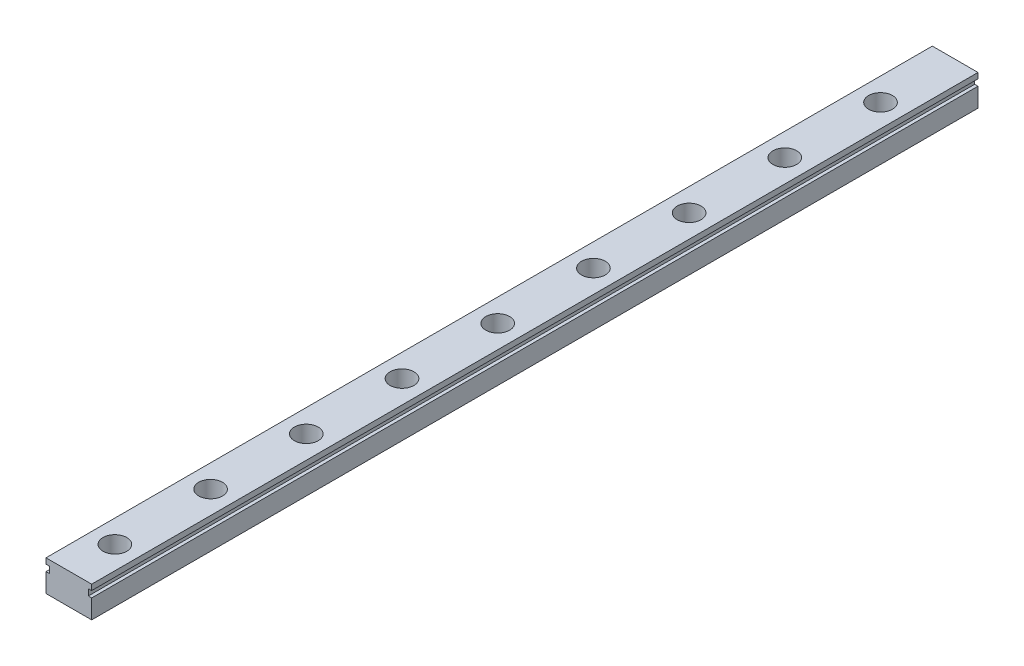
ISO-10303-21;
HEADER;
FILE_DESCRIPTION(('STEP AP214'),'2;1');
FILE_NAME('part.step','',(''),(''),'','','');
FILE_SCHEMA(('AUTOMOTIVE_DESIGN { 1 0 10303 214 1 1 1 1 }'));
ENDSEC;
DATA;
#1=APPLICATION_CONTEXT('core data for automotive mechanical design processes');
#2=APPLICATION_PROTOCOL_DEFINITION('international standard','automotive_design',2000,#1);
#3=PRODUCT_CONTEXT('',#1,'mechanical');
#4=PRODUCT('Part','Part','',(#3));
#5=PRODUCT_RELATED_PRODUCT_CATEGORY('part','',(#4));
#6=PRODUCT_DEFINITION_FORMATION('','',#4);
#7=PRODUCT_DEFINITION_CONTEXT('part definition',#1,'design');
#8=PRODUCT_DEFINITION('design','',#6,#7);
#9=PRODUCT_DEFINITION_SHAPE('','',#8);
#10=(LENGTH_UNIT() NAMED_UNIT(*) SI_UNIT(.MILLI.,.METRE.));
#11=(NAMED_UNIT(*) PLANE_ANGLE_UNIT() SI_UNIT($,.RADIAN.));
#12=(NAMED_UNIT(*) SI_UNIT($,.STERADIAN.) SOLID_ANGLE_UNIT());
#13=UNCERTAINTY_MEASURE_WITH_UNIT(LENGTH_MEASURE(1.E-05),#10,'distance_accuracy_value','');
#14=(GEOMETRIC_REPRESENTATION_CONTEXT(3) GLOBAL_UNCERTAINTY_ASSIGNED_CONTEXT((#13)) GLOBAL_UNIT_ASSIGNED_CONTEXT((#10,
#11,#12)) REPRESENTATION_CONTEXT('',''));
#15=CARTESIAN_POINT('',(0.,0.,0.));
#16=DIRECTION('',(0.,0.,1.));
#17=DIRECTION('',(1.,0.,0.));
#18=AXIS2_PLACEMENT_3D('',#15,#16,#17);
#19=CARTESIAN_POINT('',(5.75,-3.9,223.2));
#20=DIRECTION('',(-1.,0.,0.));
#21=DIRECTION('',(0.,0.,1.));
#22=AXIS2_PLACEMENT_3D('',#19,#20,#21);
#23=PLANE('',#22);
#24=DIRECTION('',(0.,1.,0.));
#25=VECTOR('',#24,1.);
#26=CARTESIAN_POINT('',(5.75,-3.9,0.));
#27=LINE('',#26,#25);
#28=CARTESIAN_POINT('',(5.75,-3.9,0.));
#29=VERTEX_POINT('',#28);
#30=CARTESIAN_POINT('',(5.75,0.900000000000001,0.));
#31=VERTEX_POINT('',#30);
#32=EDGE_CURVE('E158',#29,#31,#27,.T.);
#33=ORIENTED_EDGE('',*,*,#32,.T.);
#34=DIRECTION('',(0.,0.,1.));
#35=VECTOR('',#34,1.);
#36=CARTESIAN_POINT('',(5.75,0.900000000000001,0.));
#37=LINE('',#36,#35);
#38=CARTESIAN_POINT('',(5.75,0.900000000000001,223.2));
#39=VERTEX_POINT('',#38);
#40=EDGE_CURVE('E159',#31,#39,#37,.T.);
#41=ORIENTED_EDGE('',*,*,#40,.T.);
#42=DIRECTION('',(0.,1.,0.));
#43=VECTOR('',#42,1.);
#44=CARTESIAN_POINT('',(5.75,-3.9,223.2));
#45=LINE('',#44,#43);
#46=CARTESIAN_POINT('',(5.75,-3.9,223.2));
#47=VERTEX_POINT('',#46);
#48=EDGE_CURVE('E220',#47,#39,#45,.T.);
#49=ORIENTED_EDGE('',*,*,#48,.F.);
#50=DIRECTION('',(0.,0.,-1.));
#51=VECTOR('',#50,1.);
#52=CARTESIAN_POINT('',(5.75,-3.9,223.2));
#53=LINE('',#52,#51);
#54=EDGE_CURVE('E181',#47,#29,#53,.T.);
#55=ORIENTED_EDGE('',*,*,#54,.T.);
#56=EDGE_LOOP('',(#33,#41,#49,#55));
#57=FACE_BOUND('',#56,.T.);
#58=ADVANCED_FACE('F43',(#57),#23,.F.);
#59=CARTESIAN_POINT('',(-5.75,-3.9,223.2));
#60=DIRECTION('',(1.,0.,0.));
#61=DIRECTION('',(0.,0.,-1.));
#62=AXIS2_PLACEMENT_3D('',#59,#60,#61);
#63=PLANE('',#62);
#64=DIRECTION('',(0.,-1.,0.));
#65=VECTOR('',#64,1.);
#66=CARTESIAN_POINT('',(-5.75,-3.9,0.));
#67=LINE('',#66,#65);
#68=CARTESIAN_POINT('',(-5.75,3.9,0.));
#69=VERTEX_POINT('',#68);
#70=CARTESIAN_POINT('',(-5.75,2.5,0.));
#71=VERTEX_POINT('',#70);
#72=EDGE_CURVE('E174',#69,#71,#67,.T.);
#73=ORIENTED_EDGE('',*,*,#72,.T.);
#74=DIRECTION('',(0.,0.,1.));
#75=VECTOR('',#74,1.);
#76=CARTESIAN_POINT('',(-5.75,2.5,0.));
#77=LINE('',#76,#75);
#78=CARTESIAN_POINT('',(-5.75,2.5,223.2));
#79=VERTEX_POINT('',#78);
#80=EDGE_CURVE('E271',#71,#79,#77,.T.);
#81=ORIENTED_EDGE('',*,*,#80,.T.);
#82=DIRECTION('',(0.,-1.,0.));
#83=VECTOR('',#82,1.);
#84=CARTESIAN_POINT('',(-5.75,-3.9,223.2));
#85=LINE('',#84,#83);
#86=CARTESIAN_POINT('',(-5.75,3.9,223.2));
#87=VERTEX_POINT('',#86);
#88=EDGE_CURVE('E196',#87,#79,#85,.T.);
#89=ORIENTED_EDGE('',*,*,#88,.F.);
#90=DIRECTION('',(0.,0.,-1.));
#91=VECTOR('',#90,1.);
#92=CARTESIAN_POINT('',(-5.75,3.9,223.2));
#93=LINE('',#92,#91);
#94=EDGE_CURVE('E52',#87,#69,#93,.T.);
#95=ORIENTED_EDGE('',*,*,#94,.T.);
#96=EDGE_LOOP('',(#73,#81,#89,#95));
#97=FACE_BOUND('',#96,.T.);
#98=ADVANCED_FACE('F193',(#97),#63,.F.);
#99=CARTESIAN_POINT('',(5.75,2.5,223.2));
#100=VERTEX_POINT('',#99);
#101=CARTESIAN_POINT('',(5.75,3.9,223.2));
#102=VERTEX_POINT('',#101);
#103=EDGE_CURVE('E149',#100,#102,#45,.T.);
#104=ORIENTED_EDGE('',*,*,#103,.F.);
#105=DIRECTION('',(0.,0.,1.));
#106=VECTOR('',#105,1.);
#107=CARTESIAN_POINT('',(5.75,2.5,0.));
#108=LINE('',#107,#106);
#109=CARTESIAN_POINT('',(5.75,2.5,0.));
#110=VERTEX_POINT('',#109);
#111=EDGE_CURVE('E136',#110,#100,#108,.T.);
#112=ORIENTED_EDGE('',*,*,#111,.F.);
#113=CARTESIAN_POINT('',(5.75,3.9,0.));
#114=VERTEX_POINT('',#113);
#115=EDGE_CURVE('E147',#110,#114,#27,.T.);
#116=ORIENTED_EDGE('',*,*,#115,.T.);
#117=DIRECTION('',(0.,0.,-1.));
#118=VECTOR('',#117,1.);
#119=CARTESIAN_POINT('',(5.75,3.9,223.2));
#120=LINE('',#119,#118);
#121=EDGE_CURVE('E11',#102,#114,#120,.T.);
#122=ORIENTED_EDGE('',*,*,#121,.F.);
#123=EDGE_LOOP('',(#104,#112,#116,#122));
#124=FACE_BOUND('',#123,.T.);
#125=ADVANCED_FACE('F45',(#124),#23,.F.);
#126=CARTESIAN_POINT('',(-5.75,3.9,223.2));
#127=DIRECTION('',(0.,-1.,0.));
#128=DIRECTION('',(0.,0.,-1.));
#129=AXIS2_PLACEMENT_3D('',#126,#127,#128);
#130=PLANE('',#129);
#131=CARTESIAN_POINT('',(0.,3.9,211.6));
#132=DIRECTION('',(0.,1.,0.));
#133=DIRECTION('',(0.,0.,1.));
#134=AXIS2_PLACEMENT_3D('',#131,#132,#133);
#135=CIRCLE('',#134,3.);
#136=CARTESIAN_POINT('',(0.,3.9,214.6));
#137=VERTEX_POINT('',#136);
#138=EDGE_CURVE('E352',#137,#137,#135,.T.);
#139=ORIENTED_EDGE('',*,*,#138,.F.);
#140=EDGE_LOOP('',(#139));
#141=FACE_BOUND('',#140,.T.);
#142=CARTESIAN_POINT('',(0.,3.9,187.5));
#143=DIRECTION('',(0.,1.,0.));
#144=DIRECTION('',(0.,0.,1.));
#145=AXIS2_PLACEMENT_3D('',#142,#143,#144);
#146=CIRCLE('',#145,3.);
#147=CARTESIAN_POINT('',(0.,3.9,190.5));
#148=VERTEX_POINT('',#147);
#149=EDGE_CURVE('E348',#148,#148,#146,.T.);
#150=ORIENTED_EDGE('',*,*,#149,.F.);
#151=EDGE_LOOP('',(#150));
#152=FACE_BOUND('',#151,.T.);
#153=CARTESIAN_POINT('',(0.,3.9,163.4));
#154=DIRECTION('',(0.,1.,0.));
#155=DIRECTION('',(0.,0.,1.));
#156=AXIS2_PLACEMENT_3D('',#153,#154,#155);
#157=CIRCLE('',#156,3.);
#158=CARTESIAN_POINT('',(0.,3.9,166.4));
#159=VERTEX_POINT('',#158);
#160=EDGE_CURVE('E340',#159,#159,#157,.T.);
#161=ORIENTED_EDGE('',*,*,#160,.F.);
#162=EDGE_LOOP('',(#161));
#163=FACE_BOUND('',#162,.T.);
#164=CARTESIAN_POINT('',(0.,3.9,139.3));
#165=DIRECTION('',(0.,1.,0.));
#166=DIRECTION('',(0.,0.,1.));
#167=AXIS2_PLACEMENT_3D('',#164,#165,#166);
#168=CIRCLE('',#167,3.);
#169=CARTESIAN_POINT('',(0.,3.9,142.3));
#170=VERTEX_POINT('',#169);
#171=EDGE_CURVE('E332',#170,#170,#168,.T.);
#172=ORIENTED_EDGE('',*,*,#171,.F.);
#173=EDGE_LOOP('',(#172));
#174=FACE_BOUND('',#173,.T.);
#175=CARTESIAN_POINT('',(0.,3.9,115.2));
#176=DIRECTION('',(0.,1.,0.));
#177=DIRECTION('',(0.,0.,1.));
#178=AXIS2_PLACEMENT_3D('',#175,#176,#177);
#179=CIRCLE('',#178,3.);
#180=CARTESIAN_POINT('',(0.,3.9,118.2));
#181=VERTEX_POINT('',#180);
#182=EDGE_CURVE('E324',#181,#181,#179,.T.);
#183=ORIENTED_EDGE('',*,*,#182,.F.);
#184=EDGE_LOOP('',(#183));
#185=FACE_BOUND('',#184,.T.);
#186=CARTESIAN_POINT('',(0.,3.9,91.1));
#187=DIRECTION('',(0.,1.,0.));
#188=DIRECTION('',(0.,0.,1.));
#189=AXIS2_PLACEMENT_3D('',#186,#187,#188);
#190=CIRCLE('',#189,3.);
#191=CARTESIAN_POINT('',(0.,3.9,94.1));
#192=VERTEX_POINT('',#191);
#193=EDGE_CURVE('E316',#192,#192,#190,.T.);
#194=ORIENTED_EDGE('',*,*,#193,.F.);
#195=EDGE_LOOP('',(#194));
#196=FACE_BOUND('',#195,.T.);
#197=CARTESIAN_POINT('',(0.,3.9,67.));
#198=DIRECTION('',(0.,1.,0.));
#199=DIRECTION('',(0.,0.,1.));
#200=AXIS2_PLACEMENT_3D('',#197,#198,#199);
#201=CIRCLE('',#200,3.);
#202=CARTESIAN_POINT('',(0.,3.9,70.));
#203=VERTEX_POINT('',#202);
#204=EDGE_CURVE('E308',#203,#203,#201,.T.);
#205=ORIENTED_EDGE('',*,*,#204,.F.);
#206=EDGE_LOOP('',(#205));
#207=FACE_BOUND('',#206,.T.);
#208=CARTESIAN_POINT('',(0.,3.9,42.9));
#209=DIRECTION('',(0.,1.,0.));
#210=DIRECTION('',(0.,0.,1.));
#211=AXIS2_PLACEMENT_3D('',#208,#209,#210);
#212=CIRCLE('',#211,3.);
#213=CARTESIAN_POINT('',(0.,3.9,45.9));
#214=VERTEX_POINT('',#213);
#215=EDGE_CURVE('E300',#214,#214,#212,.T.);
#216=ORIENTED_EDGE('',*,*,#215,.F.);
#217=EDGE_LOOP('',(#216));
#218=FACE_BOUND('',#217,.T.);
#219=CARTESIAN_POINT('',(0.,3.9,18.8));
#220=DIRECTION('',(0.,1.,0.));
#221=DIRECTION('',(0.,0.,1.));
#222=AXIS2_PLACEMENT_3D('',#219,#220,#221);
#223=CIRCLE('',#222,3.);
#224=CARTESIAN_POINT('',(0.,3.9,21.8));
#225=VERTEX_POINT('',#224);
#226=EDGE_CURVE('E291',#225,#225,#223,.T.);
#227=ORIENTED_EDGE('',*,*,#226,.F.);
#228=EDGE_LOOP('',(#227));
#229=FACE_BOUND('',#228,.T.);
#230=DIRECTION('',(-1.,0.,0.));
#231=VECTOR('',#230,1.);
#232=CARTESIAN_POINT('',(-5.75,3.9,0.));
#233=LINE('',#232,#231);
#234=EDGE_CURVE('E156',#114,#69,#233,.T.);
#235=ORIENTED_EDGE('',*,*,#234,.T.);
#236=ORIENTED_EDGE('',*,*,#94,.F.);
#237=DIRECTION('',(-1.,0.,0.));
#238=VECTOR('',#237,1.);
#239=CARTESIAN_POINT('',(-5.75,3.9,223.2));
#240=LINE('',#239,#238);
#241=EDGE_CURVE('E224',#102,#87,#240,.T.);
#242=ORIENTED_EDGE('',*,*,#241,.F.);
#243=ORIENTED_EDGE('',*,*,#121,.T.);
#244=EDGE_LOOP('',(#235,#236,#242,#243));
#245=FACE_BOUND('',#244,.T.);
#246=ADVANCED_FACE('F454',(#141,#152,#163,#174,#185,#196,#207,#218,#229,#245),#130,.F.);
#247=CARTESIAN_POINT('',(-5.75,0.900000000000001,223.2));
#248=VERTEX_POINT('',#247);
#249=CARTESIAN_POINT('',(-5.75,-3.9,223.2));
#250=VERTEX_POINT('',#249);
#251=EDGE_CURVE('E226',#248,#250,#85,.T.);
#252=ORIENTED_EDGE('',*,*,#251,.F.);
#253=DIRECTION('',(0.,0.,1.));
#254=VECTOR('',#253,1.);
#255=CARTESIAN_POINT('',(-5.75,0.900000000000001,0.));
#256=LINE('',#255,#254);
#257=CARTESIAN_POINT('',(-5.75,0.900000000000001,0.));
#258=VERTEX_POINT('',#257);
#259=EDGE_CURVE('E205',#258,#248,#256,.T.);
#260=ORIENTED_EDGE('',*,*,#259,.F.);
#261=CARTESIAN_POINT('',(-5.75,-3.9,0.));
#262=VERTEX_POINT('',#261);
#263=EDGE_CURVE('E173',#258,#262,#67,.T.);
#264=ORIENTED_EDGE('',*,*,#263,.T.);
#265=DIRECTION('',(0.,0.,-1.));
#266=VECTOR('',#265,1.);
#267=CARTESIAN_POINT('',(-5.75,-3.9,223.2));
#268=LINE('',#267,#266);
#269=EDGE_CURVE('E185',#250,#262,#268,.T.);
#270=ORIENTED_EDGE('',*,*,#269,.F.);
#271=EDGE_LOOP('',(#252,#260,#264,#270));
#272=FACE_BOUND('',#271,.T.);
#273=ADVANCED_FACE('F242',(#272),#63,.F.);
#274=CARTESIAN_POINT('',(-5.75,-3.9,223.2));
#275=DIRECTION('',(0.,1.,0.));
#276=DIRECTION('',(0.,0.,1.));
#277=AXIS2_PLACEMENT_3D('',#274,#275,#276);
#278=PLANE('',#277);
#279=CARTESIAN_POINT('',(0.,-3.9,211.6));
#280=DIRECTION('',(0.,1.,0.));
#281=DIRECTION('',(0.,0.,1.));
#282=AXIS2_PLACEMENT_3D('',#279,#280,#281);
#283=CIRCLE('',#282,1.7);
#284=CARTESIAN_POINT('',(0.,-3.9,213.3));
#285=VERTEX_POINT('',#284);
#286=EDGE_CURVE('E292',#285,#285,#283,.T.);
#287=ORIENTED_EDGE('',*,*,#286,.T.);
#288=EDGE_LOOP('',(#287));
#289=FACE_BOUND('',#288,.T.);
#290=CARTESIAN_POINT('',(0.,-3.9,187.5));
#291=DIRECTION('',(0.,1.,0.));
#292=DIRECTION('',(0.,0.,1.));
#293=AXIS2_PLACEMENT_3D('',#290,#291,#292);
#294=CIRCLE('',#293,1.7);
#295=CARTESIAN_POINT('',(0.,-3.9,189.2));
#296=VERTEX_POINT('',#295);
#297=EDGE_CURVE('E415',#296,#296,#294,.T.);
#298=ORIENTED_EDGE('',*,*,#297,.T.);
#299=EDGE_LOOP('',(#298));
#300=FACE_BOUND('',#299,.T.);
#301=CARTESIAN_POINT('',(0.,-3.9,163.4));
#302=DIRECTION('',(0.,1.,0.));
#303=DIRECTION('',(0.,0.,1.));
#304=AXIS2_PLACEMENT_3D('',#301,#302,#303);
#305=CIRCLE('',#304,1.7);
#306=CARTESIAN_POINT('',(0.,-3.9,165.1));
#307=VERTEX_POINT('',#306);
#308=EDGE_CURVE('E407',#307,#307,#305,.T.);
#309=ORIENTED_EDGE('',*,*,#308,.T.);
#310=EDGE_LOOP('',(#309));
#311=FACE_BOUND('',#310,.T.);
#312=CARTESIAN_POINT('',(0.,-3.9,139.3));
#313=DIRECTION('',(0.,1.,0.));
#314=DIRECTION('',(0.,0.,1.));
#315=AXIS2_PLACEMENT_3D('',#312,#313,#314);
#316=CIRCLE('',#315,1.7);
#317=CARTESIAN_POINT('',(0.,-3.9,141.));
#318=VERTEX_POINT('',#317);
#319=EDGE_CURVE('E399',#318,#318,#316,.T.);
#320=ORIENTED_EDGE('',*,*,#319,.T.);
#321=EDGE_LOOP('',(#320));
#322=FACE_BOUND('',#321,.T.);
#323=CARTESIAN_POINT('',(0.,-3.9,115.2));
#324=DIRECTION('',(0.,1.,0.));
#325=DIRECTION('',(0.,0.,1.));
#326=AXIS2_PLACEMENT_3D('',#323,#324,#325);
#327=CIRCLE('',#326,1.7);
#328=CARTESIAN_POINT('',(0.,-3.9,116.9));
#329=VERTEX_POINT('',#328);
#330=EDGE_CURVE('E391',#329,#329,#327,.T.);
#331=ORIENTED_EDGE('',*,*,#330,.T.);
#332=EDGE_LOOP('',(#331));
#333=FACE_BOUND('',#332,.T.);
#334=CARTESIAN_POINT('',(0.,-3.9,91.1));
#335=DIRECTION('',(0.,1.,0.));
#336=DIRECTION('',(0.,0.,1.));
#337=AXIS2_PLACEMENT_3D('',#334,#335,#336);
#338=CIRCLE('',#337,1.7);
#339=CARTESIAN_POINT('',(0.,-3.9,92.8));
#340=VERTEX_POINT('',#339);
#341=EDGE_CURVE('E383',#340,#340,#338,.T.);
#342=ORIENTED_EDGE('',*,*,#341,.T.);
#343=EDGE_LOOP('',(#342));
#344=FACE_BOUND('',#343,.T.);
#345=CARTESIAN_POINT('',(0.,-3.9,67.));
#346=DIRECTION('',(0.,1.,0.));
#347=DIRECTION('',(0.,0.,1.));
#348=AXIS2_PLACEMENT_3D('',#345,#346,#347);
#349=CIRCLE('',#348,1.7);
#350=CARTESIAN_POINT('',(0.,-3.9,68.7));
#351=VERTEX_POINT('',#350);
#352=EDGE_CURVE('E375',#351,#351,#349,.T.);
#353=ORIENTED_EDGE('',*,*,#352,.T.);
#354=EDGE_LOOP('',(#353));
#355=FACE_BOUND('',#354,.T.);
#356=CARTESIAN_POINT('',(0.,-3.9,42.9));
#357=DIRECTION('',(0.,1.,0.));
#358=DIRECTION('',(0.,0.,1.));
#359=AXIS2_PLACEMENT_3D('',#356,#357,#358);
#360=CIRCLE('',#359,1.7);
#361=CARTESIAN_POINT('',(0.,-3.9,44.6));
#362=VERTEX_POINT('',#361);
#363=EDGE_CURVE('E367',#362,#362,#360,.T.);
#364=ORIENTED_EDGE('',*,*,#363,.T.);
#365=EDGE_LOOP('',(#364));
#366=FACE_BOUND('',#365,.T.);
#367=CARTESIAN_POINT('',(0.,-3.9,18.8));
#368=DIRECTION('',(0.,1.,0.));
#369=DIRECTION('',(0.,0.,1.));
#370=AXIS2_PLACEMENT_3D('',#367,#368,#369);
#371=CIRCLE('',#370,1.7);
#372=CARTESIAN_POINT('',(0.,-3.9,20.5));
#373=VERTEX_POINT('',#372);
#374=EDGE_CURVE('E359',#373,#373,#371,.T.);
#375=ORIENTED_EDGE('',*,*,#374,.T.);
#376=EDGE_LOOP('',(#375));
#377=FACE_BOUND('',#376,.T.);
#378=DIRECTION('',(1.,0.,0.));
#379=VECTOR('',#378,1.);
#380=CARTESIAN_POINT('',(-5.75,-3.9,0.));
#381=LINE('',#380,#379);
#382=EDGE_CURVE('E178',#262,#29,#381,.T.);
#383=ORIENTED_EDGE('',*,*,#382,.T.);
#384=ORIENTED_EDGE('',*,*,#54,.F.);
#385=DIRECTION('',(1.,0.,0.));
#386=VECTOR('',#385,1.);
#387=CARTESIAN_POINT('',(-5.75,-3.9,223.2));
#388=LINE('',#387,#386);
#389=EDGE_CURVE('E169',#250,#47,#388,.T.);
#390=ORIENTED_EDGE('',*,*,#389,.F.);
#391=ORIENTED_EDGE('',*,*,#269,.T.);
#392=EDGE_LOOP('',(#383,#384,#390,#391));
#393=FACE_BOUND('',#392,.T.);
#394=ADVANCED_FACE('F246',(#289,#300,#311,#322,#333,#344,#355,#366,#377,#393),#278,.F.);
#395=CARTESIAN_POINT('',(0.,0.,223.2));
#396=DIRECTION('',(0.,0.,-1.));
#397=DIRECTION('',(-1.,0.,0.));
#398=AXIS2_PLACEMENT_3D('',#395,#396,#397);
#399=PLANE('',#398);
#400=ORIENTED_EDGE('',*,*,#48,.T.);
#401=DIRECTION('',(1.,0.,0.));
#402=VECTOR('',#401,1.);
#403=CARTESIAN_POINT('',(5.75,0.900000000000001,223.2));
#404=LINE('',#403,#402);
#405=CARTESIAN_POINT('',(4.91474977144023,0.900000000000001,223.2));
#406=VERTEX_POINT('',#405);
#407=EDGE_CURVE('E142',#406,#39,#404,.T.);
#408=ORIENTED_EDGE('',*,*,#407,.F.);
#409=DIRECTION('',(0.,-1.,0.));
#410=VECTOR('',#409,1.);
#411=CARTESIAN_POINT('',(4.91474977144023,2.5,223.2));
#412=LINE('',#411,#410);
#413=CARTESIAN_POINT('',(4.91474977144023,2.5,223.2));
#414=VERTEX_POINT('',#413);
#415=EDGE_CURVE('E253',#414,#406,#412,.T.);
#416=ORIENTED_EDGE('',*,*,#415,.F.);
#417=DIRECTION('',(-1.,0.,0.));
#418=VECTOR('',#417,1.);
#419=CARTESIAN_POINT('',(5.75,2.5,223.2));
#420=LINE('',#419,#418);
#421=EDGE_CURVE('E258',#100,#414,#420,.T.);
#422=ORIENTED_EDGE('',*,*,#421,.F.);
#423=ORIENTED_EDGE('',*,*,#103,.T.);
#424=ORIENTED_EDGE('',*,*,#241,.T.);
#425=ORIENTED_EDGE('',*,*,#88,.T.);
#426=DIRECTION('',(-1.,0.,0.));
#427=VECTOR('',#426,1.);
#428=CARTESIAN_POINT('',(-5.75,2.5,223.2));
#429=LINE('',#428,#427);
#430=CARTESIAN_POINT('',(-4.91474977144023,2.5,223.2));
#431=VERTEX_POINT('',#430);
#432=EDGE_CURVE('E219',#431,#79,#429,.T.);
#433=ORIENTED_EDGE('',*,*,#432,.F.);
#434=DIRECTION('',(0.,1.,0.));
#435=VECTOR('',#434,1.);
#436=CARTESIAN_POINT('',(-4.91474977144023,2.5,223.2));
#437=LINE('',#436,#435);
#438=CARTESIAN_POINT('',(-4.91474977144023,0.900000000000001,223.2));
#439=VERTEX_POINT('',#438);
#440=EDGE_CURVE('E276',#439,#431,#437,.T.);
#441=ORIENTED_EDGE('',*,*,#440,.F.);
#442=DIRECTION('',(1.,0.,0.));
#443=VECTOR('',#442,1.);
#444=CARTESIAN_POINT('',(-5.75,0.900000000000001,223.2));
#445=LINE('',#444,#443);
#446=EDGE_CURVE('E214',#248,#439,#445,.T.);
#447=ORIENTED_EDGE('',*,*,#446,.F.);
#448=ORIENTED_EDGE('',*,*,#251,.T.);
#449=ORIENTED_EDGE('',*,*,#389,.T.);
#450=EDGE_LOOP('',(#400,#408,#416,#422,#423,#424,#425,#433,#441,#447,#448,#449));
#451=FACE_BOUND('',#450,.T.);
#452=ADVANCED_FACE('F235',(#451),#399,.F.);
#453=CARTESIAN_POINT('',(0.,0.,0.));
#454=DIRECTION('',(0.,0.,-1.));
#455=DIRECTION('',(-1.,0.,0.));
#456=AXIS2_PLACEMENT_3D('',#453,#454,#455);
#457=PLANE('',#456);
#458=DIRECTION('',(1.,0.,0.));
#459=VECTOR('',#458,1.);
#460=CARTESIAN_POINT('',(5.75,0.900000000000001,0.));
#461=LINE('',#460,#459);
#462=CARTESIAN_POINT('',(4.91474977144023,0.900000000000001,0.));
#463=VERTEX_POINT('',#462);
#464=EDGE_CURVE('E151',#463,#31,#461,.T.);
#465=ORIENTED_EDGE('',*,*,#464,.T.);
#466=ORIENTED_EDGE('',*,*,#32,.F.);
#467=ORIENTED_EDGE('',*,*,#382,.F.);
#468=ORIENTED_EDGE('',*,*,#263,.F.);
#469=DIRECTION('',(1.,0.,0.));
#470=VECTOR('',#469,1.);
#471=CARTESIAN_POINT('',(-5.75,0.900000000000001,0.));
#472=LINE('',#471,#470);
#473=CARTESIAN_POINT('',(-4.91474977144023,0.900000000000001,0.));
#474=VERTEX_POINT('',#473);
#475=EDGE_CURVE('E209',#258,#474,#472,.T.);
#476=ORIENTED_EDGE('',*,*,#475,.T.);
#477=DIRECTION('',(0.,1.,0.));
#478=VECTOR('',#477,1.);
#479=CARTESIAN_POINT('',(-4.91474977144023,2.5,0.));
#480=LINE('',#479,#478);
#481=CARTESIAN_POINT('',(-4.91474977144023,2.5,0.));
#482=VERTEX_POINT('',#481);
#483=EDGE_CURVE('E67',#474,#482,#480,.T.);
#484=ORIENTED_EDGE('',*,*,#483,.T.);
#485=DIRECTION('',(-1.,0.,0.));
#486=VECTOR('',#485,1.);
#487=CARTESIAN_POINT('',(-5.75,2.5,0.));
#488=LINE('',#487,#486);
#489=EDGE_CURVE('E201',#482,#71,#488,.T.);
#490=ORIENTED_EDGE('',*,*,#489,.T.);
#491=ORIENTED_EDGE('',*,*,#72,.F.);
#492=ORIENTED_EDGE('',*,*,#234,.F.);
#493=ORIENTED_EDGE('',*,*,#115,.F.);
#494=DIRECTION('',(-1.,0.,0.));
#495=VECTOR('',#494,1.);
#496=CARTESIAN_POINT('',(5.75,2.5,0.));
#497=LINE('',#496,#495);
#498=CARTESIAN_POINT('',(4.91474977144023,2.5,0.));
#499=VERTEX_POINT('',#498);
#500=EDGE_CURVE('E132',#110,#499,#497,.T.);
#501=ORIENTED_EDGE('',*,*,#500,.T.);
#502=DIRECTION('',(0.,-1.,0.));
#503=VECTOR('',#502,1.);
#504=CARTESIAN_POINT('',(4.91474977144023,2.5,0.));
#505=LINE('',#504,#503);
#506=EDGE_CURVE('E59',#499,#463,#505,.T.);
#507=ORIENTED_EDGE('',*,*,#506,.T.);
#508=EDGE_LOOP('',(#465,#466,#467,#468,#476,#484,#490,#491,#492,#493,#501,#507));
#509=FACE_BOUND('',#508,.T.);
#510=ADVANCED_FACE('F154',(#509),#457,.T.);
#511=CARTESIAN_POINT('',(-5.75,2.5,0.));
#512=DIRECTION('',(0.,1.,0.));
#513=DIRECTION('',(0.,0.,1.));
#514=AXIS2_PLACEMENT_3D('',#511,#512,#513);
#515=PLANE('',#514);
#516=ORIENTED_EDGE('',*,*,#432,.T.);
#517=ORIENTED_EDGE('',*,*,#80,.F.);
#518=ORIENTED_EDGE('',*,*,#489,.F.);
#519=DIRECTION('',(0.,0.,1.));
#520=VECTOR('',#519,1.);
#521=CARTESIAN_POINT('',(-4.91474977144023,2.5,0.));
#522=LINE('',#521,#520);
#523=EDGE_CURVE('E268',#482,#431,#522,.T.);
#524=ORIENTED_EDGE('',*,*,#523,.T.);
#525=EDGE_LOOP('',(#516,#517,#518,#524));
#526=FACE_BOUND('',#525,.T.);
#527=ADVANCED_FACE('F531',(#526),#515,.F.);
#528=CARTESIAN_POINT('',(-4.91474977144023,2.5,0.));
#529=DIRECTION('',(1.,0.,0.));
#530=DIRECTION('',(0.,0.,-1.));
#531=AXIS2_PLACEMENT_3D('',#528,#529,#530);
#532=PLANE('',#531);
#533=ORIENTED_EDGE('',*,*,#440,.T.);
#534=ORIENTED_EDGE('',*,*,#523,.F.);
#535=ORIENTED_EDGE('',*,*,#483,.F.);
#536=DIRECTION('',(0.,0.,1.));
#537=VECTOR('',#536,1.);
#538=CARTESIAN_POINT('',(-4.91474977144023,0.900000000000001,0.));
#539=LINE('',#538,#537);
#540=EDGE_CURVE('E211',#474,#439,#539,.T.);
#541=ORIENTED_EDGE('',*,*,#540,.T.);
#542=EDGE_LOOP('',(#533,#534,#535,#541));
#543=FACE_BOUND('',#542,.T.);
#544=ADVANCED_FACE('F538',(#543),#532,.F.);
#545=CARTESIAN_POINT('',(-5.75,0.900000000000001,0.));
#546=DIRECTION('',(0.,-1.,0.));
#547=DIRECTION('',(0.,0.,-1.));
#548=AXIS2_PLACEMENT_3D('',#545,#546,#547);
#549=PLANE('',#548);
#550=ORIENTED_EDGE('',*,*,#446,.T.);
#551=ORIENTED_EDGE('',*,*,#540,.F.);
#552=ORIENTED_EDGE('',*,*,#475,.F.);
#553=ORIENTED_EDGE('',*,*,#259,.T.);
#554=EDGE_LOOP('',(#550,#551,#552,#553));
#555=FACE_BOUND('',#554,.T.);
#556=ADVANCED_FACE('F545',(#555),#549,.F.);
#557=CARTESIAN_POINT('',(5.75,0.900000000000001,0.));
#558=DIRECTION('',(0.,-1.,0.));
#559=DIRECTION('',(0.,0.,-1.));
#560=AXIS2_PLACEMENT_3D('',#557,#558,#559);
#561=PLANE('',#560);
#562=ORIENTED_EDGE('',*,*,#407,.T.);
#563=ORIENTED_EDGE('',*,*,#40,.F.);
#564=ORIENTED_EDGE('',*,*,#464,.F.);
#565=DIRECTION('',(0.,0.,1.));
#566=VECTOR('',#565,1.);
#567=CARTESIAN_POINT('',(4.91474977144023,0.900000000000001,0.));
#568=LINE('',#567,#566);
#569=EDGE_CURVE('E165',#463,#406,#568,.T.);
#570=ORIENTED_EDGE('',*,*,#569,.T.);
#571=EDGE_LOOP('',(#562,#563,#564,#570));
#572=FACE_BOUND('',#571,.T.);
#573=ADVANCED_FACE('F552',(#572),#561,.F.);
#574=CARTESIAN_POINT('',(4.91474977144023,2.5,0.));
#575=DIRECTION('',(-1.,0.,0.));
#576=DIRECTION('',(0.,0.,1.));
#577=AXIS2_PLACEMENT_3D('',#574,#575,#576);
#578=PLANE('',#577);
#579=ORIENTED_EDGE('',*,*,#415,.T.);
#580=ORIENTED_EDGE('',*,*,#569,.F.);
#581=ORIENTED_EDGE('',*,*,#506,.F.);
#582=DIRECTION('',(0.,0.,1.));
#583=VECTOR('',#582,1.);
#584=CARTESIAN_POINT('',(4.91474977144023,2.5,0.));
#585=LINE('',#584,#583);
#586=EDGE_CURVE('E138',#499,#414,#585,.T.);
#587=ORIENTED_EDGE('',*,*,#586,.T.);
#588=EDGE_LOOP('',(#579,#580,#581,#587));
#589=FACE_BOUND('',#588,.T.);
#590=ADVANCED_FACE('F487',(#589),#578,.F.);
#591=CARTESIAN_POINT('',(5.75,2.5,0.));
#592=DIRECTION('',(0.,1.,0.));
#593=DIRECTION('',(0.,0.,1.));
#594=AXIS2_PLACEMENT_3D('',#591,#592,#593);
#595=PLANE('',#594);
#596=ORIENTED_EDGE('',*,*,#421,.T.);
#597=ORIENTED_EDGE('',*,*,#586,.F.);
#598=ORIENTED_EDGE('',*,*,#500,.F.);
#599=ORIENTED_EDGE('',*,*,#111,.T.);
#600=EDGE_LOOP('',(#596,#597,#598,#599));
#601=FACE_BOUND('',#600,.T.);
#602=ADVANCED_FACE('F135',(#601),#595,.F.);
#603=CARTESIAN_POINT('',(0.,-0.799999999999999,18.8));
#604=DIRECTION('',(0.,1.,0.));
#605=DIRECTION('',(0.,0.,1.));
#606=AXIS2_PLACEMENT_3D('',#603,#604,#605);
#607=CYLINDRICAL_SURFACE('',#606,3.);
#608=CARTESIAN_POINT('',(0.,-0.799999999999999,18.8));
#609=DIRECTION('',(0.,1.,0.));
#610=DIRECTION('',(0.,0.,1.));
#611=AXIS2_PLACEMENT_3D('',#608,#609,#610);
#612=CIRCLE('',#611,3.);
#613=CARTESIAN_POINT('',(0.,-0.799999999999999,21.8));
#614=VERTEX_POINT('',#613);
#615=EDGE_CURVE('E287',#614,#614,#612,.T.);
#616=ORIENTED_EDGE('',*,*,#615,.F.);
#617=EDGE_LOOP('',(#616));
#618=FACE_BOUND('',#617,.T.);
#619=ORIENTED_EDGE('',*,*,#226,.T.);
#620=EDGE_LOOP('',(#619));
#621=FACE_BOUND('',#620,.T.);
#622=ADVANCED_FACE('F475',(#618,#621),#607,.F.);
#623=CARTESIAN_POINT('',(0.,-0.799999999999999,18.8));
#624=DIRECTION('',(0.,1.,0.));
#625=DIRECTION('',(0.,0.,1.));
#626=AXIS2_PLACEMENT_3D('',#623,#624,#625);
#627=PLANE('',#626);
#628=CARTESIAN_POINT('',(0.,-0.799999999999999,18.8));
#629=DIRECTION('',(0.,1.,0.));
#630=DIRECTION('',(0.,0.,1.));
#631=AXIS2_PLACEMENT_3D('',#628,#629,#630);
#632=CIRCLE('',#631,1.7);
#633=CARTESIAN_POINT('',(0.,-0.799999999999999,20.5));
#634=VERTEX_POINT('',#633);
#635=EDGE_CURVE('E363',#634,#634,#632,.T.);
#636=ORIENTED_EDGE('',*,*,#635,.F.);
#637=EDGE_LOOP('',(#636));
#638=FACE_BOUND('',#637,.T.);
#639=ORIENTED_EDGE('',*,*,#615,.T.);
#640=EDGE_LOOP('',(#639));
#641=FACE_BOUND('',#640,.T.);
#642=ADVANCED_FACE('F477',(#638,#641),#627,.T.);
#643=CARTESIAN_POINT('',(0.,-0.799999999999999,42.9));
#644=DIRECTION('',(0.,1.,0.));
#645=DIRECTION('',(0.,0.,1.));
#646=AXIS2_PLACEMENT_3D('',#643,#644,#645);
#647=CYLINDRICAL_SURFACE('',#646,3.);
#648=CARTESIAN_POINT('',(0.,-0.799999999999999,42.9));
#649=DIRECTION('',(0.,1.,0.));
#650=DIRECTION('',(0.,0.,1.));
#651=AXIS2_PLACEMENT_3D('',#648,#649,#650);
#652=CIRCLE('',#651,3.);
#653=CARTESIAN_POINT('',(0.,-0.799999999999999,45.9));
#654=VERTEX_POINT('',#653);
#655=EDGE_CURVE('E296',#654,#654,#652,.T.);
#656=ORIENTED_EDGE('',*,*,#655,.F.);
#657=EDGE_LOOP('',(#656));
#658=FACE_BOUND('',#657,.T.);
#659=ORIENTED_EDGE('',*,*,#215,.T.);
#660=EDGE_LOOP('',(#659));
#661=FACE_BOUND('',#660,.T.);
#662=ADVANCED_FACE('F484',(#658,#661),#647,.F.);
#663=CARTESIAN_POINT('',(0.,-0.799999999999999,42.9));
#664=DIRECTION('',(0.,1.,0.));
#665=DIRECTION('',(0.,0.,1.));
#666=AXIS2_PLACEMENT_3D('',#663,#664,#665);
#667=PLANE('',#666);
#668=CARTESIAN_POINT('',(0.,-0.799999999999999,42.9));
#669=DIRECTION('',(0.,1.,0.));
#670=DIRECTION('',(0.,0.,1.));
#671=AXIS2_PLACEMENT_3D('',#668,#669,#670);
#672=CIRCLE('',#671,1.7);
#673=CARTESIAN_POINT('',(0.,-0.799999999999999,44.6));
#674=VERTEX_POINT('',#673);
#675=EDGE_CURVE('E371',#674,#674,#672,.T.);
#676=ORIENTED_EDGE('',*,*,#675,.F.);
#677=EDGE_LOOP('',(#676));
#678=FACE_BOUND('',#677,.T.);
#679=ORIENTED_EDGE('',*,*,#655,.T.);
#680=EDGE_LOOP('',(#679));
#681=FACE_BOUND('',#680,.T.);
#682=ADVANCED_FACE('F597',(#678,#681),#667,.T.);
#683=CARTESIAN_POINT('',(0.,-0.799999999999999,67.));
#684=DIRECTION('',(0.,1.,0.));
#685=DIRECTION('',(0.,0.,1.));
#686=AXIS2_PLACEMENT_3D('',#683,#684,#685);
#687=CYLINDRICAL_SURFACE('',#686,3.);
#688=CARTESIAN_POINT('',(0.,-0.799999999999999,67.));
#689=DIRECTION('',(0.,1.,0.));
#690=DIRECTION('',(0.,0.,1.));
#691=AXIS2_PLACEMENT_3D('',#688,#689,#690);
#692=CIRCLE('',#691,3.);
#693=CARTESIAN_POINT('',(0.,-0.799999999999999,70.));
#694=VERTEX_POINT('',#693);
#695=EDGE_CURVE('E304',#694,#694,#692,.T.);
#696=ORIENTED_EDGE('',*,*,#695,.F.);
#697=EDGE_LOOP('',(#696));
#698=FACE_BOUND('',#697,.T.);
#699=ORIENTED_EDGE('',*,*,#204,.T.);
#700=EDGE_LOOP('',(#699));
#701=FACE_BOUND('',#700,.T.);
#702=ADVANCED_FACE('F608',(#698,#701),#687,.F.);
#703=CARTESIAN_POINT('',(0.,-0.799999999999999,67.));
#704=DIRECTION('',(0.,1.,0.));
#705=DIRECTION('',(0.,0.,1.));
#706=AXIS2_PLACEMENT_3D('',#703,#704,#705);
#707=PLANE('',#706);
#708=CARTESIAN_POINT('',(0.,-0.799999999999999,67.));
#709=DIRECTION('',(0.,1.,0.));
#710=DIRECTION('',(0.,0.,1.));
#711=AXIS2_PLACEMENT_3D('',#708,#709,#710);
#712=CIRCLE('',#711,1.7);
#713=CARTESIAN_POINT('',(0.,-0.799999999999999,68.7));
#714=VERTEX_POINT('',#713);
#715=EDGE_CURVE('E379',#714,#714,#712,.T.);
#716=ORIENTED_EDGE('',*,*,#715,.F.);
#717=EDGE_LOOP('',(#716));
#718=FACE_BOUND('',#717,.T.);
#719=ORIENTED_EDGE('',*,*,#695,.T.);
#720=EDGE_LOOP('',(#719));
#721=FACE_BOUND('',#720,.T.);
#722=ADVANCED_FACE('F618',(#718,#721),#707,.T.);
#723=CARTESIAN_POINT('',(0.,-0.799999999999999,91.1));
#724=DIRECTION('',(0.,1.,0.));
#725=DIRECTION('',(0.,0.,1.));
#726=AXIS2_PLACEMENT_3D('',#723,#724,#725);
#727=CYLINDRICAL_SURFACE('',#726,3.);
#728=CARTESIAN_POINT('',(0.,-0.799999999999999,91.1));
#729=DIRECTION('',(0.,1.,0.));
#730=DIRECTION('',(0.,0.,1.));
#731=AXIS2_PLACEMENT_3D('',#728,#729,#730);
#732=CIRCLE('',#731,3.);
#733=CARTESIAN_POINT('',(0.,-0.799999999999999,94.1));
#734=VERTEX_POINT('',#733);
#735=EDGE_CURVE('E312',#734,#734,#732,.T.);
#736=ORIENTED_EDGE('',*,*,#735,.F.);
#737=EDGE_LOOP('',(#736));
#738=FACE_BOUND('',#737,.T.);
#739=ORIENTED_EDGE('',*,*,#193,.T.);
#740=EDGE_LOOP('',(#739));
#741=FACE_BOUND('',#740,.T.);
#742=ADVANCED_FACE('F629',(#738,#741),#727,.F.);
#743=CARTESIAN_POINT('',(0.,-0.799999999999999,91.1));
#744=DIRECTION('',(0.,1.,0.));
#745=DIRECTION('',(0.,0.,1.));
#746=AXIS2_PLACEMENT_3D('',#743,#744,#745);
#747=PLANE('',#746);
#748=CARTESIAN_POINT('',(0.,-0.799999999999999,91.1));
#749=DIRECTION('',(0.,1.,0.));
#750=DIRECTION('',(0.,0.,1.));
#751=AXIS2_PLACEMENT_3D('',#748,#749,#750);
#752=CIRCLE('',#751,1.7);
#753=CARTESIAN_POINT('',(0.,-0.799999999999999,92.8));
#754=VERTEX_POINT('',#753);
#755=EDGE_CURVE('E387',#754,#754,#752,.T.);
#756=ORIENTED_EDGE('',*,*,#755,.F.);
#757=EDGE_LOOP('',(#756));
#758=FACE_BOUND('',#757,.T.);
#759=ORIENTED_EDGE('',*,*,#735,.T.);
#760=EDGE_LOOP('',(#759));
#761=FACE_BOUND('',#760,.T.);
#762=ADVANCED_FACE('F640',(#758,#761),#747,.T.);
#763=CARTESIAN_POINT('',(0.,-0.799999999999999,115.2));
#764=DIRECTION('',(0.,1.,0.));
#765=DIRECTION('',(0.,0.,1.));
#766=AXIS2_PLACEMENT_3D('',#763,#764,#765);
#767=CYLINDRICAL_SURFACE('',#766,3.);
#768=CARTESIAN_POINT('',(0.,-0.799999999999999,115.2));
#769=DIRECTION('',(0.,1.,0.));
#770=DIRECTION('',(0.,0.,1.));
#771=AXIS2_PLACEMENT_3D('',#768,#769,#770);
#772=CIRCLE('',#771,3.);
#773=CARTESIAN_POINT('',(0.,-0.799999999999999,118.2));
#774=VERTEX_POINT('',#773);
#775=EDGE_CURVE('E320',#774,#774,#772,.T.);
#776=ORIENTED_EDGE('',*,*,#775,.F.);
#777=EDGE_LOOP('',(#776));
#778=FACE_BOUND('',#777,.T.);
#779=ORIENTED_EDGE('',*,*,#182,.T.);
#780=EDGE_LOOP('',(#779));
#781=FACE_BOUND('',#780,.T.);
#782=ADVANCED_FACE('F651',(#778,#781),#767,.F.);
#783=CARTESIAN_POINT('',(0.,-0.799999999999999,115.2));
#784=DIRECTION('',(0.,1.,0.));
#785=DIRECTION('',(0.,0.,1.));
#786=AXIS2_PLACEMENT_3D('',#783,#784,#785);
#787=PLANE('',#786);
#788=CARTESIAN_POINT('',(0.,-0.799999999999999,115.2));
#789=DIRECTION('',(0.,1.,0.));
#790=DIRECTION('',(0.,0.,1.));
#791=AXIS2_PLACEMENT_3D('',#788,#789,#790);
#792=CIRCLE('',#791,1.7);
#793=CARTESIAN_POINT('',(0.,-0.799999999999999,116.9));
#794=VERTEX_POINT('',#793);
#795=EDGE_CURVE('E395',#794,#794,#792,.T.);
#796=ORIENTED_EDGE('',*,*,#795,.F.);
#797=EDGE_LOOP('',(#796));
#798=FACE_BOUND('',#797,.T.);
#799=ORIENTED_EDGE('',*,*,#775,.T.);
#800=EDGE_LOOP('',(#799));
#801=FACE_BOUND('',#800,.T.);
#802=ADVANCED_FACE('F662',(#798,#801),#787,.T.);
#803=CARTESIAN_POINT('',(0.,-0.799999999999999,139.3));
#804=DIRECTION('',(0.,1.,0.));
#805=DIRECTION('',(0.,0.,1.));
#806=AXIS2_PLACEMENT_3D('',#803,#804,#805);
#807=CYLINDRICAL_SURFACE('',#806,3.);
#808=CARTESIAN_POINT('',(0.,-0.799999999999999,139.3));
#809=DIRECTION('',(0.,1.,0.));
#810=DIRECTION('',(0.,0.,1.));
#811=AXIS2_PLACEMENT_3D('',#808,#809,#810);
#812=CIRCLE('',#811,3.);
#813=CARTESIAN_POINT('',(0.,-0.799999999999999,142.3));
#814=VERTEX_POINT('',#813);
#815=EDGE_CURVE('E328',#814,#814,#812,.T.);
#816=ORIENTED_EDGE('',*,*,#815,.F.);
#817=EDGE_LOOP('',(#816));
#818=FACE_BOUND('',#817,.T.);
#819=ORIENTED_EDGE('',*,*,#171,.T.);
#820=EDGE_LOOP('',(#819));
#821=FACE_BOUND('',#820,.T.);
#822=ADVANCED_FACE('F673',(#818,#821),#807,.F.);
#823=CARTESIAN_POINT('',(0.,-0.799999999999999,139.3));
#824=DIRECTION('',(0.,1.,0.));
#825=DIRECTION('',(0.,0.,1.));
#826=AXIS2_PLACEMENT_3D('',#823,#824,#825);
#827=PLANE('',#826);
#828=CARTESIAN_POINT('',(0.,-0.799999999999999,139.3));
#829=DIRECTION('',(0.,1.,0.));
#830=DIRECTION('',(0.,0.,1.));
#831=AXIS2_PLACEMENT_3D('',#828,#829,#830);
#832=CIRCLE('',#831,1.7);
#833=CARTESIAN_POINT('',(0.,-0.799999999999999,141.));
#834=VERTEX_POINT('',#833);
#835=EDGE_CURVE('E403',#834,#834,#832,.T.);
#836=ORIENTED_EDGE('',*,*,#835,.F.);
#837=EDGE_LOOP('',(#836));
#838=FACE_BOUND('',#837,.T.);
#839=ORIENTED_EDGE('',*,*,#815,.T.);
#840=EDGE_LOOP('',(#839));
#841=FACE_BOUND('',#840,.T.);
#842=ADVANCED_FACE('F684',(#838,#841),#827,.T.);
#843=CARTESIAN_POINT('',(0.,-0.799999999999999,163.4));
#844=DIRECTION('',(0.,1.,0.));
#845=DIRECTION('',(0.,0.,1.));
#846=AXIS2_PLACEMENT_3D('',#843,#844,#845);
#847=CYLINDRICAL_SURFACE('',#846,3.);
#848=CARTESIAN_POINT('',(0.,-0.799999999999999,163.4));
#849=DIRECTION('',(0.,1.,0.));
#850=DIRECTION('',(0.,0.,1.));
#851=AXIS2_PLACEMENT_3D('',#848,#849,#850);
#852=CIRCLE('',#851,3.);
#853=CARTESIAN_POINT('',(0.,-0.799999999999999,166.4));
#854=VERTEX_POINT('',#853);
#855=EDGE_CURVE('E336',#854,#854,#852,.T.);
#856=ORIENTED_EDGE('',*,*,#855,.F.);
#857=EDGE_LOOP('',(#856));
#858=FACE_BOUND('',#857,.T.);
#859=ORIENTED_EDGE('',*,*,#160,.T.);
#860=EDGE_LOOP('',(#859));
#861=FACE_BOUND('',#860,.T.);
#862=ADVANCED_FACE('F695',(#858,#861),#847,.F.);
#863=CARTESIAN_POINT('',(0.,-0.799999999999999,163.4));
#864=DIRECTION('',(0.,1.,0.));
#865=DIRECTION('',(0.,0.,1.));
#866=AXIS2_PLACEMENT_3D('',#863,#864,#865);
#867=PLANE('',#866);
#868=CARTESIAN_POINT('',(0.,-0.799999999999999,163.4));
#869=DIRECTION('',(0.,1.,0.));
#870=DIRECTION('',(0.,0.,1.));
#871=AXIS2_PLACEMENT_3D('',#868,#869,#870);
#872=CIRCLE('',#871,1.7);
#873=CARTESIAN_POINT('',(0.,-0.799999999999999,165.1));
#874=VERTEX_POINT('',#873);
#875=EDGE_CURVE('E411',#874,#874,#872,.T.);
#876=ORIENTED_EDGE('',*,*,#875,.F.);
#877=EDGE_LOOP('',(#876));
#878=FACE_BOUND('',#877,.T.);
#879=ORIENTED_EDGE('',*,*,#855,.T.);
#880=EDGE_LOOP('',(#879));
#881=FACE_BOUND('',#880,.T.);
#882=ADVANCED_FACE('F706',(#878,#881),#867,.T.);
#883=CARTESIAN_POINT('',(0.,-0.799999999999999,187.5));
#884=DIRECTION('',(0.,1.,0.));
#885=DIRECTION('',(0.,0.,1.));
#886=AXIS2_PLACEMENT_3D('',#883,#884,#885);
#887=CYLINDRICAL_SURFACE('',#886,3.);
#888=CARTESIAN_POINT('',(0.,-0.799999999999999,187.5));
#889=DIRECTION('',(0.,1.,0.));
#890=DIRECTION('',(0.,0.,1.));
#891=AXIS2_PLACEMENT_3D('',#888,#889,#890);
#892=CIRCLE('',#891,3.);
#893=CARTESIAN_POINT('',(0.,-0.799999999999999,190.5));
#894=VERTEX_POINT('',#893);
#895=EDGE_CURVE('E344',#894,#894,#892,.T.);
#896=ORIENTED_EDGE('',*,*,#895,.F.);
#897=EDGE_LOOP('',(#896));
#898=FACE_BOUND('',#897,.T.);
#899=ORIENTED_EDGE('',*,*,#149,.T.);
#900=EDGE_LOOP('',(#899));
#901=FACE_BOUND('',#900,.T.);
#902=ADVANCED_FACE('F717',(#898,#901),#887,.F.);
#903=CARTESIAN_POINT('',(0.,-0.799999999999999,187.5));
#904=DIRECTION('',(0.,1.,0.));
#905=DIRECTION('',(0.,0.,1.));
#906=AXIS2_PLACEMENT_3D('',#903,#904,#905);
#907=PLANE('',#906);
#908=CARTESIAN_POINT('',(0.,-0.799999999999999,187.5));
#909=DIRECTION('',(0.,1.,0.));
#910=DIRECTION('',(0.,0.,1.));
#911=AXIS2_PLACEMENT_3D('',#908,#909,#910);
#912=CIRCLE('',#911,1.7);
#913=CARTESIAN_POINT('',(0.,-0.799999999999999,189.2));
#914=VERTEX_POINT('',#913);
#915=EDGE_CURVE('E419',#914,#914,#912,.T.);
#916=ORIENTED_EDGE('',*,*,#915,.F.);
#917=EDGE_LOOP('',(#916));
#918=FACE_BOUND('',#917,.T.);
#919=ORIENTED_EDGE('',*,*,#895,.T.);
#920=EDGE_LOOP('',(#919));
#921=FACE_BOUND('',#920,.T.);
#922=ADVANCED_FACE('F450',(#918,#921),#907,.T.);
#923=CARTESIAN_POINT('',(0.,-0.799999999999999,211.6));
#924=DIRECTION('',(0.,1.,0.));
#925=DIRECTION('',(0.,0.,1.));
#926=AXIS2_PLACEMENT_3D('',#923,#924,#925);
#927=CYLINDRICAL_SURFACE('',#926,3.);
#928=CARTESIAN_POINT('',(0.,-0.799999999999999,211.6));
#929=DIRECTION('',(0.,1.,0.));
#930=DIRECTION('',(0.,0.,1.));
#931=AXIS2_PLACEMENT_3D('',#928,#929,#930);
#932=CIRCLE('',#931,3.);
#933=CARTESIAN_POINT('',(0.,-0.799999999999999,214.6));
#934=VERTEX_POINT('',#933);
#935=EDGE_CURVE('E274',#934,#934,#932,.T.);
#936=ORIENTED_EDGE('',*,*,#935,.F.);
#937=EDGE_LOOP('',(#936));
#938=FACE_BOUND('',#937,.T.);
#939=ORIENTED_EDGE('',*,*,#138,.T.);
#940=EDGE_LOOP('',(#939));
#941=FACE_BOUND('',#940,.T.);
#942=ADVANCED_FACE('F444',(#938,#941),#927,.F.);
#943=CARTESIAN_POINT('',(0.,-0.799999999999999,211.6));
#944=DIRECTION('',(0.,1.,0.));
#945=DIRECTION('',(0.,0.,1.));
#946=AXIS2_PLACEMENT_3D('',#943,#944,#945);
#947=PLANE('',#946);
#948=CARTESIAN_POINT('',(0.,-0.799999999999999,211.6));
#949=DIRECTION('',(0.,1.,0.));
#950=DIRECTION('',(0.,0.,1.));
#951=AXIS2_PLACEMENT_3D('',#948,#949,#950);
#952=CIRCLE('',#951,1.7);
#953=CARTESIAN_POINT('',(0.,-0.799999999999999,213.3));
#954=VERTEX_POINT('',#953);
#955=EDGE_CURVE('E423',#954,#954,#952,.T.);
#956=ORIENTED_EDGE('',*,*,#955,.F.);
#957=EDGE_LOOP('',(#956));
#958=FACE_BOUND('',#957,.T.);
#959=ORIENTED_EDGE('',*,*,#935,.T.);
#960=EDGE_LOOP('',(#959));
#961=FACE_BOUND('',#960,.T.);
#962=ADVANCED_FACE('F440',(#958,#961),#947,.T.);
#963=CARTESIAN_POINT('',(0.,-3.9,18.8));
#964=DIRECTION('',(0.,1.,0.));
#965=DIRECTION('',(0.,0.,1.));
#966=AXIS2_PLACEMENT_3D('',#963,#964,#965);
#967=CYLINDRICAL_SURFACE('',#966,1.7);
#968=ORIENTED_EDGE('',*,*,#374,.F.);
#969=EDGE_LOOP('',(#968));
#970=FACE_BOUND('',#969,.T.);
#971=ORIENTED_EDGE('',*,*,#635,.T.);
#972=EDGE_LOOP('',(#971));
#973=FACE_BOUND('',#972,.T.);
#974=ADVANCED_FACE('F443',(#970,#973),#967,.F.);
#975=CARTESIAN_POINT('',(0.,-3.9,42.9));
#976=DIRECTION('',(0.,1.,0.));
#977=DIRECTION('',(0.,0.,1.));
#978=AXIS2_PLACEMENT_3D('',#975,#976,#977);
#979=CYLINDRICAL_SURFACE('',#978,1.7);
#980=ORIENTED_EDGE('',*,*,#363,.F.);
#981=EDGE_LOOP('',(#980));
#982=FACE_BOUND('',#981,.T.);
#983=ORIENTED_EDGE('',*,*,#675,.T.);
#984=EDGE_LOOP('',(#983));
#985=FACE_BOUND('',#984,.T.);
#986=ADVANCED_FACE('F760',(#982,#985),#979,.F.);
#987=CARTESIAN_POINT('',(0.,-3.9,67.));
#988=DIRECTION('',(0.,1.,0.));
#989=DIRECTION('',(0.,0.,1.));
#990=AXIS2_PLACEMENT_3D('',#987,#988,#989);
#991=CYLINDRICAL_SURFACE('',#990,1.7);
#992=ORIENTED_EDGE('',*,*,#352,.F.);
#993=EDGE_LOOP('',(#992));
#994=FACE_BOUND('',#993,.T.);
#995=ORIENTED_EDGE('',*,*,#715,.T.);
#996=EDGE_LOOP('',(#995));
#997=FACE_BOUND('',#996,.T.);
#998=ADVANCED_FACE('F771',(#994,#997),#991,.F.);
#999=CARTESIAN_POINT('',(0.,-3.9,91.1));
#1000=DIRECTION('',(0.,1.,0.));
#1001=DIRECTION('',(0.,0.,1.));
#1002=AXIS2_PLACEMENT_3D('',#999,#1000,#1001);
#1003=CYLINDRICAL_SURFACE('',#1002,1.7);
#1004=ORIENTED_EDGE('',*,*,#341,.F.);
#1005=EDGE_LOOP('',(#1004));
#1006=FACE_BOUND('',#1005,.T.);
#1007=ORIENTED_EDGE('',*,*,#755,.T.);
#1008=EDGE_LOOP('',(#1007));
#1009=FACE_BOUND('',#1008,.T.);
#1010=ADVANCED_FACE('F782',(#1006,#1009),#1003,.F.);
#1011=CARTESIAN_POINT('',(0.,-3.9,115.2));
#1012=DIRECTION('',(0.,1.,0.));
#1013=DIRECTION('',(0.,0.,1.));
#1014=AXIS2_PLACEMENT_3D('',#1011,#1012,#1013);
#1015=CYLINDRICAL_SURFACE('',#1014,1.7);
#1016=ORIENTED_EDGE('',*,*,#330,.F.);
#1017=EDGE_LOOP('',(#1016));
#1018=FACE_BOUND('',#1017,.T.);
#1019=ORIENTED_EDGE('',*,*,#795,.T.);
#1020=EDGE_LOOP('',(#1019));
#1021=FACE_BOUND('',#1020,.T.);
#1022=ADVANCED_FACE('F793',(#1018,#1021),#1015,.F.);
#1023=CARTESIAN_POINT('',(0.,-3.9,139.3));
#1024=DIRECTION('',(0.,1.,0.));
#1025=DIRECTION('',(0.,0.,1.));
#1026=AXIS2_PLACEMENT_3D('',#1023,#1024,#1025);
#1027=CYLINDRICAL_SURFACE('',#1026,1.7);
#1028=ORIENTED_EDGE('',*,*,#319,.F.);
#1029=EDGE_LOOP('',(#1028));
#1030=FACE_BOUND('',#1029,.T.);
#1031=ORIENTED_EDGE('',*,*,#835,.T.);
#1032=EDGE_LOOP('',(#1031));
#1033=FACE_BOUND('',#1032,.T.);
#1034=ADVANCED_FACE('F804',(#1030,#1033),#1027,.F.);
#1035=CARTESIAN_POINT('',(0.,-3.9,163.4));
#1036=DIRECTION('',(0.,1.,0.));
#1037=DIRECTION('',(0.,0.,1.));
#1038=AXIS2_PLACEMENT_3D('',#1035,#1036,#1037);
#1039=CYLINDRICAL_SURFACE('',#1038,1.7);
#1040=ORIENTED_EDGE('',*,*,#308,.F.);
#1041=EDGE_LOOP('',(#1040));
#1042=FACE_BOUND('',#1041,.T.);
#1043=ORIENTED_EDGE('',*,*,#875,.T.);
#1044=EDGE_LOOP('',(#1043));
#1045=FACE_BOUND('',#1044,.T.);
#1046=ADVANCED_FACE('F815',(#1042,#1045),#1039,.F.);
#1047=CARTESIAN_POINT('',(0.,-3.9,187.5));
#1048=DIRECTION('',(0.,1.,0.));
#1049=DIRECTION('',(0.,0.,1.));
#1050=AXIS2_PLACEMENT_3D('',#1047,#1048,#1049);
#1051=CYLINDRICAL_SURFACE('',#1050,1.7);
#1052=ORIENTED_EDGE('',*,*,#297,.F.);
#1053=EDGE_LOOP('',(#1052));
#1054=FACE_BOUND('',#1053,.T.);
#1055=ORIENTED_EDGE('',*,*,#915,.T.);
#1056=EDGE_LOOP('',(#1055));
#1057=FACE_BOUND('',#1056,.T.);
#1058=ADVANCED_FACE('F436',(#1054,#1057),#1051,.F.);
#1059=CARTESIAN_POINT('',(0.,-3.9,211.6));
#1060=DIRECTION('',(0.,1.,0.));
#1061=DIRECTION('',(0.,0.,1.));
#1062=AXIS2_PLACEMENT_3D('',#1059,#1060,#1061);
#1063=CYLINDRICAL_SURFACE('',#1062,1.7);
#1064=ORIENTED_EDGE('',*,*,#286,.F.);
#1065=EDGE_LOOP('',(#1064));
#1066=FACE_BOUND('',#1065,.T.);
#1067=ORIENTED_EDGE('',*,*,#955,.T.);
#1068=EDGE_LOOP('',(#1067));
#1069=FACE_BOUND('',#1068,.T.);
#1070=ADVANCED_FACE('F433',(#1066,#1069),#1063,.F.);
#1071=CLOSED_SHELL('',(#58,#98,#125,#246,#273,#394,#452,#510,#527,#544,#556,#573,#590,#602,#622,
#642,#662,#682,#702,#722,#742,#762,#782,#802,#822,#842,#862,#882,#902,#922,#942,#962,#974,#986,
#998,#1010,#1022,#1034,#1046,#1058,#1070));
#1072=MANIFOLD_SOLID_BREP('B2',#1071);
#1073=ADVANCED_BREP_SHAPE_REPRESENTATION('',(#18,#1072),#14);
#1074=SHAPE_DEFINITION_REPRESENTATION(#9,#1073);
ENDSEC;
END-ISO-10303-21;
